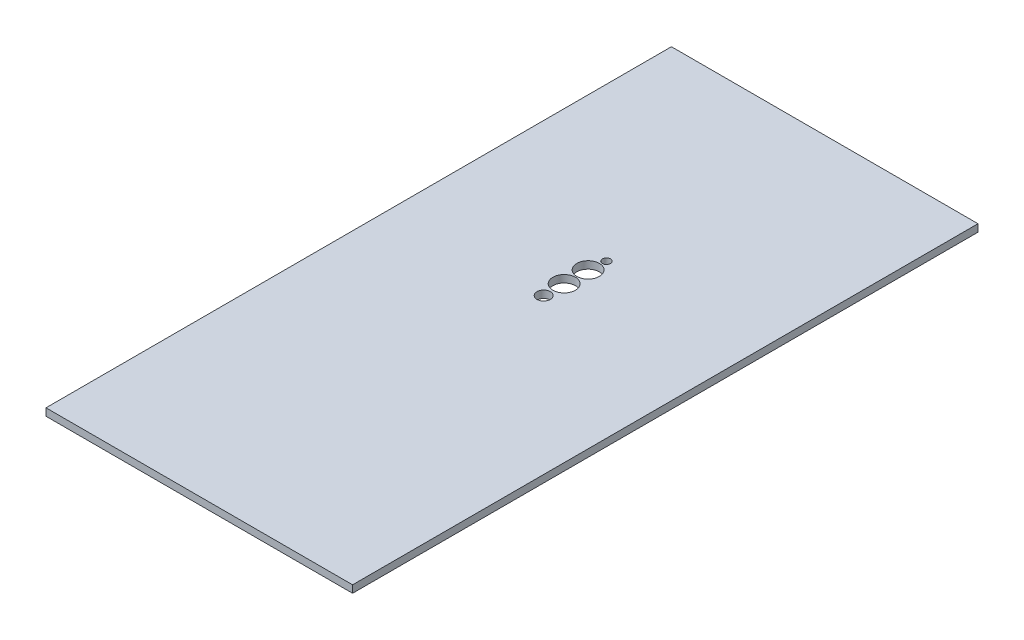
ISO-10303-21;
HEADER;
FILE_DESCRIPTION(('STEP AP214'),'2;1');
FILE_NAME('part.step','',(''),(''),'','','');
FILE_SCHEMA(('AUTOMOTIVE_DESIGN { 1 0 10303 214 1 1 1 1 }'));
ENDSEC;
DATA;
#1=APPLICATION_CONTEXT('core data for automotive mechanical design processes');
#2=APPLICATION_PROTOCOL_DEFINITION('international standard','automotive_design',2000,#1);
#3=PRODUCT_CONTEXT('',#1,'mechanical');
#4=PRODUCT('Part','Part','',(#3));
#5=PRODUCT_RELATED_PRODUCT_CATEGORY('part','',(#4));
#6=PRODUCT_DEFINITION_FORMATION('','',#4);
#7=PRODUCT_DEFINITION_CONTEXT('part definition',#1,'design');
#8=PRODUCT_DEFINITION('design','',#6,#7);
#9=PRODUCT_DEFINITION_SHAPE('','',#8);
#10=(LENGTH_UNIT() NAMED_UNIT(*) SI_UNIT(.MILLI.,.METRE.));
#11=(NAMED_UNIT(*) PLANE_ANGLE_UNIT() SI_UNIT($,.RADIAN.));
#12=(NAMED_UNIT(*) SI_UNIT($,.STERADIAN.) SOLID_ANGLE_UNIT());
#13=UNCERTAINTY_MEASURE_WITH_UNIT(LENGTH_MEASURE(1.E-05),#10,'distance_accuracy_value','');
#14=(GEOMETRIC_REPRESENTATION_CONTEXT(3) GLOBAL_UNCERTAINTY_ASSIGNED_CONTEXT((#13)) GLOBAL_UNIT_ASSIGNED_CONTEXT((#10,
#11,#12)) REPRESENTATION_CONTEXT('',''));
#15=CARTESIAN_POINT('',(0.,0.,0.));
#16=DIRECTION('',(0.,0.,1.));
#17=DIRECTION('',(1.,0.,0.));
#18=AXIS2_PLACEMENT_3D('',#15,#16,#17);
#19=CARTESIAN_POINT('',(0.,6.,0.));
#20=DIRECTION('',(1.,0.,0.));
#21=DIRECTION('',(0.,0.,-1.));
#22=AXIS2_PLACEMENT_3D('',#19,#20,#21);
#23=PLANE('',#22);
#24=DIRECTION('',(0.,1.,0.));
#25=VECTOR('',#24,1.);
#26=CARTESIAN_POINT('',(0.,6.,-35.));
#27=LINE('',#26,#25);
#28=CARTESIAN_POINT('',(0.,0.,-35.));
#29=VERTEX_POINT('',#28);
#30=CARTESIAN_POINT('',(0.,6.,-35.));
#31=VERTEX_POINT('',#30);
#32=EDGE_CURVE('E114',#29,#31,#27,.T.);
#33=ORIENTED_EDGE('',*,*,#32,.F.);
#34=DIRECTION('',(0.,0.,1.));
#35=VECTOR('',#34,1.);
#36=CARTESIAN_POINT('',(0.,0.,0.));
#37=LINE('',#36,#35);
#38=CARTESIAN_POINT('',(0.,0.,475.));
#39=VERTEX_POINT('',#38);
#40=EDGE_CURVE('E90',#29,#39,#37,.T.);
#41=ORIENTED_EDGE('',*,*,#40,.T.);
#42=DIRECTION('',(0.,-1.,0.));
#43=VECTOR('',#42,1.);
#44=CARTESIAN_POINT('',(0.,6.,475.));
#45=LINE('',#44,#43);
#46=CARTESIAN_POINT('',(0.,6.,475.));
#47=VERTEX_POINT('',#46);
#48=EDGE_CURVE('E11',#47,#39,#45,.T.);
#49=ORIENTED_EDGE('',*,*,#48,.F.);
#50=DIRECTION('',(0.,0.,1.));
#51=VECTOR('',#50,1.);
#52=CARTESIAN_POINT('',(0.,6.,0.));
#53=LINE('',#52,#51);
#54=EDGE_CURVE('E100',#31,#47,#53,.T.);
#55=ORIENTED_EDGE('',*,*,#54,.F.);
#56=EDGE_LOOP('',(#33,#41,#49,#55));
#57=FACE_BOUND('',#56,.T.);
#58=ADVANCED_FACE('F44',(#57),#23,.F.);
#59=CARTESIAN_POINT('',(250.,6.,0.));
#60=DIRECTION('',(-1.,0.,0.));
#61=DIRECTION('',(0.,0.,1.));
#62=AXIS2_PLACEMENT_3D('',#59,#60,#61);
#63=PLANE('',#62);
#64=DIRECTION('',(0.,-1.,0.));
#65=VECTOR('',#64,1.);
#66=CARTESIAN_POINT('',(250.,6.,-35.));
#67=LINE('',#66,#65);
#68=CARTESIAN_POINT('',(250.,6.,-35.));
#69=VERTEX_POINT('',#68);
#70=CARTESIAN_POINT('',(250.,0.,-35.));
#71=VERTEX_POINT('',#70);
#72=EDGE_CURVE('E59',#69,#71,#67,.T.);
#73=ORIENTED_EDGE('',*,*,#72,.F.);
#74=DIRECTION('',(0.,0.,-1.));
#75=VECTOR('',#74,1.);
#76=CARTESIAN_POINT('',(250.,6.,0.));
#77=LINE('',#76,#75);
#78=CARTESIAN_POINT('',(250.,6.,475.));
#79=VERTEX_POINT('',#78);
#80=EDGE_CURVE('E95',#79,#69,#77,.T.);
#81=ORIENTED_EDGE('',*,*,#80,.F.);
#82=DIRECTION('',(0.,-1.,0.));
#83=VECTOR('',#82,1.);
#84=CARTESIAN_POINT('',(250.,6.,475.));
#85=LINE('',#84,#83);
#86=CARTESIAN_POINT('',(250.,0.,475.));
#87=VERTEX_POINT('',#86);
#88=EDGE_CURVE('E52',#79,#87,#85,.T.);
#89=ORIENTED_EDGE('',*,*,#88,.T.);
#90=DIRECTION('',(0.,0.,-1.));
#91=VECTOR('',#90,1.);
#92=CARTESIAN_POINT('',(250.,0.,0.));
#93=LINE('',#92,#91);
#94=EDGE_CURVE('E89',#87,#71,#93,.T.);
#95=ORIENTED_EDGE('',*,*,#94,.T.);
#96=EDGE_LOOP('',(#73,#81,#89,#95));
#97=FACE_BOUND('',#96,.T.);
#98=ADVANCED_FACE('F94',(#97),#63,.F.);
#99=CARTESIAN_POINT('',(0.,6.,0.));
#100=DIRECTION('',(0.,1.,0.));
#101=DIRECTION('',(0.,0.,1.));
#102=AXIS2_PLACEMENT_3D('',#99,#100,#101);
#103=PLANE('',#102);
#104=CARTESIAN_POINT('',(125.,6.,142.973629020178));
#105=DIRECTION('',(0.,1.,0.));
#106=DIRECTION('',(0.,0.,1.));
#107=AXIS2_PLACEMENT_3D('',#104,#105,#106);
#108=CIRCLE('',#107,3.3);
#109=CARTESIAN_POINT('',(125.,6.,146.273629020178));
#110=VERTEX_POINT('',#109);
#111=EDGE_CURVE('E147',#110,#110,#108,.T.);
#112=ORIENTED_EDGE('',*,*,#111,.F.);
#113=EDGE_LOOP('',(#112));
#114=FACE_BOUND('',#113,.T.);
#115=CARTESIAN_POINT('',(123.645994783822,6.,156.588756812347));
#116=DIRECTION('',(0.,1.,0.));
#117=DIRECTION('',(0.,0.,1.));
#118=AXIS2_PLACEMENT_3D('',#115,#116,#117);
#119=CIRCLE('',#118,9.20000000000003);
#120=CARTESIAN_POINT('',(123.645994783822,6.,165.788756812347));
#121=VERTEX_POINT('',#120);
#122=EDGE_CURVE('E143',#121,#121,#119,.T.);
#123=ORIENTED_EDGE('',*,*,#122,.F.);
#124=EDGE_LOOP('',(#123));
#125=FACE_BOUND('',#124,.T.);
#126=CARTESIAN_POINT('',(123.645994783822,6.,176.121700587853));
#127=DIRECTION('',(0.,1.,0.));
#128=DIRECTION('',(0.,0.,1.));
#129=AXIS2_PLACEMENT_3D('',#126,#127,#128);
#130=CIRCLE('',#129,9.20000000000004);
#131=CARTESIAN_POINT('',(123.645994783822,6.,185.321700587853));
#132=VERTEX_POINT('',#131);
#133=EDGE_CURVE('E135',#132,#132,#130,.T.);
#134=ORIENTED_EDGE('',*,*,#133,.F.);
#135=EDGE_LOOP('',(#134));
#136=FACE_BOUND('',#135,.T.);
#137=CARTESIAN_POINT('',(123.645994783822,6.,192.796164786455));
#138=DIRECTION('',(0.,1.,0.));
#139=DIRECTION('',(0.,0.,1.));
#140=AXIS2_PLACEMENT_3D('',#137,#138,#139);
#141=CIRCLE('',#140,5.5);
#142=CARTESIAN_POINT('',(123.645994783822,6.,198.296164786455));
#143=VERTEX_POINT('',#142);
#144=EDGE_CURVE('E127',#143,#143,#141,.T.);
#145=ORIENTED_EDGE('',*,*,#144,.F.);
#146=EDGE_LOOP('',(#145));
#147=FACE_BOUND('',#146,.T.);
#148=ORIENTED_EDGE('',*,*,#80,.T.);
#149=DIRECTION('',(1.,0.,0.));
#150=VECTOR('',#149,1.);
#151=CARTESIAN_POINT('',(250.,6.,-35.));
#152=LINE('',#151,#150);
#153=EDGE_CURVE('E107',#31,#69,#152,.T.);
#154=ORIENTED_EDGE('',*,*,#153,.F.);
#155=ORIENTED_EDGE('',*,*,#54,.T.);
#156=DIRECTION('',(1.,0.,0.));
#157=VECTOR('',#156,1.);
#158=CARTESIAN_POINT('',(0.,6.,475.));
#159=LINE('',#158,#157);
#160=EDGE_CURVE('E68',#47,#79,#159,.T.);
#161=ORIENTED_EDGE('',*,*,#160,.T.);
#162=EDGE_LOOP('',(#148,#154,#155,#161));
#163=FACE_BOUND('',#162,.T.);
#164=ADVANCED_FACE('F164',(#114,#125,#136,#147,#163),#103,.T.);
#165=CARTESIAN_POINT('',(0.,0.,0.));
#166=DIRECTION('',(0.,1.,0.));
#167=DIRECTION('',(0.,0.,1.));
#168=AXIS2_PLACEMENT_3D('',#165,#166,#167);
#169=PLANE('',#168);
#170=CARTESIAN_POINT('',(125.,0.,142.973629020178));
#171=DIRECTION('',(0.,1.,0.));
#172=DIRECTION('',(0.,0.,1.));
#173=AXIS2_PLACEMENT_3D('',#170,#171,#172);
#174=CIRCLE('',#173,3.3);
#175=CARTESIAN_POINT('',(125.,0.,146.273629020178));
#176=VERTEX_POINT('',#175);
#177=EDGE_CURVE('E122',#176,#176,#174,.T.);
#178=ORIENTED_EDGE('',*,*,#177,.T.);
#179=EDGE_LOOP('',(#178));
#180=FACE_BOUND('',#179,.T.);
#181=CARTESIAN_POINT('',(123.645994783822,0.,156.588756812347));
#182=DIRECTION('',(0.,1.,0.));
#183=DIRECTION('',(0.,0.,1.));
#184=AXIS2_PLACEMENT_3D('',#181,#182,#183);
#185=CIRCLE('',#184,9.20000000000003);
#186=CARTESIAN_POINT('',(123.645994783822,0.,165.788756812347));
#187=VERTEX_POINT('',#186);
#188=EDGE_CURVE('E139',#187,#187,#185,.T.);
#189=ORIENTED_EDGE('',*,*,#188,.T.);
#190=EDGE_LOOP('',(#189));
#191=FACE_BOUND('',#190,.T.);
#192=CARTESIAN_POINT('',(123.645994783822,0.,176.121700587853));
#193=DIRECTION('',(0.,1.,0.));
#194=DIRECTION('',(0.,0.,1.));
#195=AXIS2_PLACEMENT_3D('',#192,#193,#194);
#196=CIRCLE('',#195,9.20000000000004);
#197=CARTESIAN_POINT('',(123.645994783822,0.,185.321700587853));
#198=VERTEX_POINT('',#197);
#199=EDGE_CURVE('E131',#198,#198,#196,.T.);
#200=ORIENTED_EDGE('',*,*,#199,.T.);
#201=EDGE_LOOP('',(#200));
#202=FACE_BOUND('',#201,.T.);
#203=CARTESIAN_POINT('',(123.645994783822,0.,192.796164786455));
#204=DIRECTION('',(0.,1.,0.));
#205=DIRECTION('',(0.,0.,1.));
#206=AXIS2_PLACEMENT_3D('',#203,#204,#205);
#207=CIRCLE('',#206,5.5);
#208=CARTESIAN_POINT('',(123.645994783822,0.,198.296164786455));
#209=VERTEX_POINT('',#208);
#210=EDGE_CURVE('E123',#209,#209,#207,.T.);
#211=ORIENTED_EDGE('',*,*,#210,.T.);
#212=EDGE_LOOP('',(#211));
#213=FACE_BOUND('',#212,.T.);
#214=DIRECTION('',(-1.,0.,0.));
#215=VECTOR('',#214,1.);
#216=CARTESIAN_POINT('',(250.,0.,-35.));
#217=LINE('',#216,#215);
#218=EDGE_CURVE('E98',#71,#29,#217,.T.);
#219=ORIENTED_EDGE('',*,*,#218,.F.);
#220=ORIENTED_EDGE('',*,*,#94,.F.);
#221=DIRECTION('',(1.,0.,0.));
#222=VECTOR('',#221,1.);
#223=CARTESIAN_POINT('',(0.,0.,475.));
#224=LINE('',#223,#222);
#225=EDGE_CURVE('E80',#39,#87,#224,.T.);
#226=ORIENTED_EDGE('',*,*,#225,.F.);
#227=ORIENTED_EDGE('',*,*,#40,.F.);
#228=EDGE_LOOP('',(#219,#220,#226,#227));
#229=FACE_BOUND('',#228,.T.);
#230=ADVANCED_FACE('F97',(#180,#191,#202,#213,#229),#169,.F.);
#231=CARTESIAN_POINT('',(0.,6.,475.));
#232=DIRECTION('',(0.,0.,-1.));
#233=DIRECTION('',(-1.,0.,0.));
#234=AXIS2_PLACEMENT_3D('',#231,#232,#233);
#235=PLANE('',#234);
#236=ORIENTED_EDGE('',*,*,#225,.T.);
#237=ORIENTED_EDGE('',*,*,#88,.F.);
#238=ORIENTED_EDGE('',*,*,#160,.F.);
#239=ORIENTED_EDGE('',*,*,#48,.T.);
#240=EDGE_LOOP('',(#236,#237,#238,#239));
#241=FACE_BOUND('',#240,.T.);
#242=ADVANCED_FACE('F82',(#241),#235,.F.);
#243=CARTESIAN_POINT('',(0.,0.,-35.));
#244=DIRECTION('',(0.,0.,-1.));
#245=DIRECTION('',(-1.,0.,0.));
#246=AXIS2_PLACEMENT_3D('',#243,#244,#245);
#247=PLANE('',#246);
#248=ORIENTED_EDGE('',*,*,#72,.T.);
#249=ORIENTED_EDGE('',*,*,#218,.T.);
#250=ORIENTED_EDGE('',*,*,#32,.T.);
#251=ORIENTED_EDGE('',*,*,#153,.T.);
#252=EDGE_LOOP('',(#248,#249,#250,#251));
#253=FACE_BOUND('',#252,.T.);
#254=ADVANCED_FACE('F180',(#253),#247,.T.);
#255=CARTESIAN_POINT('',(123.645994783822,0.,192.796164786455));
#256=DIRECTION('',(0.,1.,0.));
#257=DIRECTION('',(0.,0.,1.));
#258=AXIS2_PLACEMENT_3D('',#255,#256,#257);
#259=CYLINDRICAL_SURFACE('',#258,5.5);
#260=ORIENTED_EDGE('',*,*,#210,.F.);
#261=EDGE_LOOP('',(#260));
#262=FACE_BOUND('',#261,.T.);
#263=ORIENTED_EDGE('',*,*,#144,.T.);
#264=EDGE_LOOP('',(#263));
#265=FACE_BOUND('',#264,.T.);
#266=ADVANCED_FACE('F197',(#262,#265),#259,.F.);
#267=CARTESIAN_POINT('',(123.645994783822,0.,176.121700587853));
#268=DIRECTION('',(0.,1.,0.));
#269=DIRECTION('',(0.,0.,1.));
#270=AXIS2_PLACEMENT_3D('',#267,#268,#269);
#271=CYLINDRICAL_SURFACE('',#270,9.20000000000004);
#272=ORIENTED_EDGE('',*,*,#199,.F.);
#273=EDGE_LOOP('',(#272));
#274=FACE_BOUND('',#273,.T.);
#275=ORIENTED_EDGE('',*,*,#133,.T.);
#276=EDGE_LOOP('',(#275));
#277=FACE_BOUND('',#276,.T.);
#278=ADVANCED_FACE('F213',(#274,#277),#271,.F.);
#279=CARTESIAN_POINT('',(123.645994783822,0.,156.588756812347));
#280=DIRECTION('',(0.,1.,0.));
#281=DIRECTION('',(0.,0.,1.));
#282=AXIS2_PLACEMENT_3D('',#279,#280,#281);
#283=CYLINDRICAL_SURFACE('',#282,9.20000000000003);
#284=ORIENTED_EDGE('',*,*,#188,.F.);
#285=EDGE_LOOP('',(#284));
#286=FACE_BOUND('',#285,.T.);
#287=ORIENTED_EDGE('',*,*,#122,.T.);
#288=EDGE_LOOP('',(#287));
#289=FACE_BOUND('',#288,.T.);
#290=ADVANCED_FACE('F160',(#286,#289),#283,.F.);
#291=CARTESIAN_POINT('',(125.,0.,142.973629020178));
#292=DIRECTION('',(0.,1.,0.));
#293=DIRECTION('',(0.,0.,1.));
#294=AXIS2_PLACEMENT_3D('',#291,#292,#293);
#295=CYLINDRICAL_SURFACE('',#294,3.3);
#296=ORIENTED_EDGE('',*,*,#177,.F.);
#297=EDGE_LOOP('',(#296));
#298=FACE_BOUND('',#297,.T.);
#299=ORIENTED_EDGE('',*,*,#111,.T.);
#300=EDGE_LOOP('',(#299));
#301=FACE_BOUND('',#300,.T.);
#302=ADVANCED_FACE('F157',(#298,#301),#295,.F.);
#303=CLOSED_SHELL('',(#58,#98,#164,#230,#242,#254,#266,#278,#290,#302));
#304=MANIFOLD_SOLID_BREP('B2',#303);
#305=ADVANCED_BREP_SHAPE_REPRESENTATION('',(#18,#304),#14);
#306=SHAPE_DEFINITION_REPRESENTATION(#9,#305);
ENDSEC;
END-ISO-10303-21;
